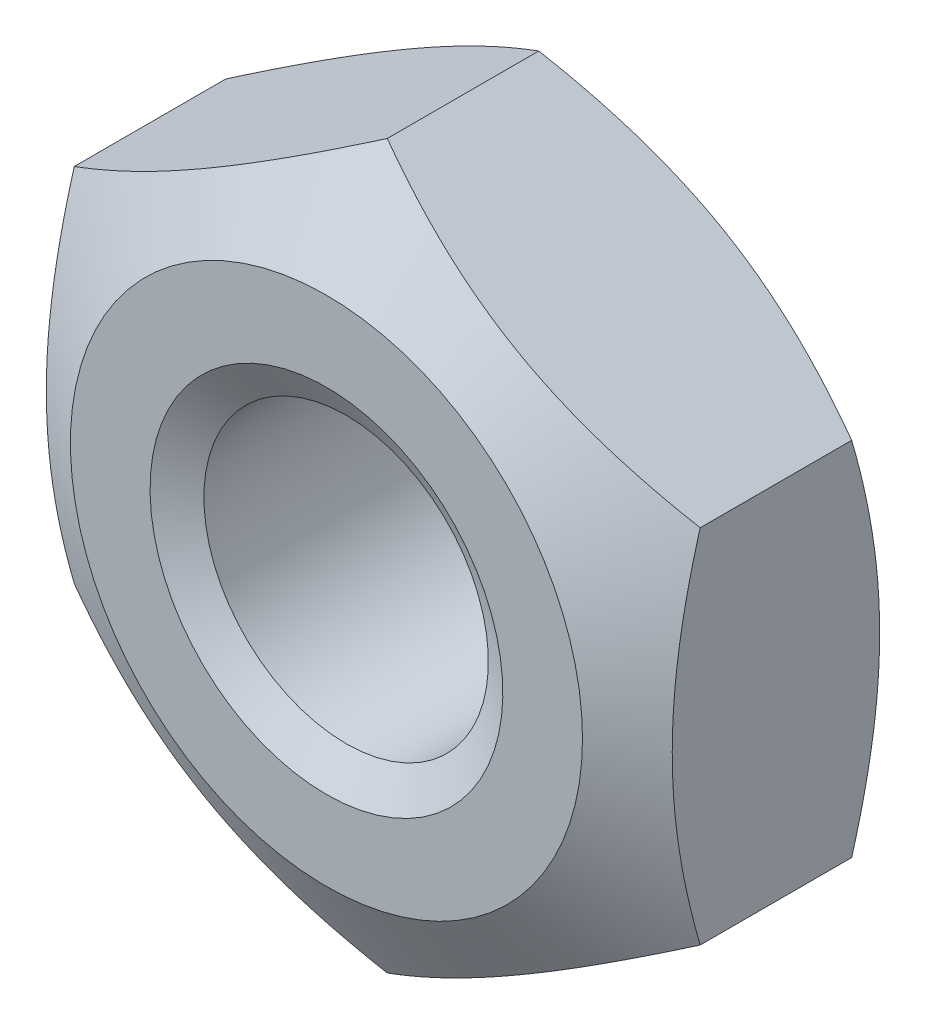
ISO-10303-21;
HEADER;
FILE_DESCRIPTION(('STEP AP214'),'2;1');
FILE_NAME('part.step','',(''),(''),'','','');
FILE_SCHEMA(('AUTOMOTIVE_DESIGN { 1 0 10303 214 1 1 1 1 }'));
ENDSEC;
DATA;
#1=APPLICATION_CONTEXT('core data for automotive mechanical design processes');
#2=APPLICATION_PROTOCOL_DEFINITION('international standard','automotive_design',2000,#1);
#3=PRODUCT_CONTEXT('',#1,'mechanical');
#4=PRODUCT('Part','Part','',(#3));
#5=PRODUCT_RELATED_PRODUCT_CATEGORY('part','',(#4));
#6=PRODUCT_DEFINITION_FORMATION('','',#4);
#7=PRODUCT_DEFINITION_CONTEXT('part definition',#1,'design');
#8=PRODUCT_DEFINITION('design','',#6,#7);
#9=PRODUCT_DEFINITION_SHAPE('','',#8);
#10=(LENGTH_UNIT() NAMED_UNIT(*) SI_UNIT(.MILLI.,.METRE.));
#11=(NAMED_UNIT(*) PLANE_ANGLE_UNIT() SI_UNIT($,.RADIAN.));
#12=(NAMED_UNIT(*) SI_UNIT($,.STERADIAN.) SOLID_ANGLE_UNIT());
#13=UNCERTAINTY_MEASURE_WITH_UNIT(LENGTH_MEASURE(1.E-05),#10,'distance_accuracy_value','');
#14=(GEOMETRIC_REPRESENTATION_CONTEXT(3) GLOBAL_UNCERTAINTY_ASSIGNED_CONTEXT((#13)) GLOBAL_UNIT_ASSIGNED_CONTEXT((#10,
#11,#12)) REPRESENTATION_CONTEXT('',''));
#15=CARTESIAN_POINT('',(0.,0.,0.));
#16=DIRECTION('',(0.,0.,1.));
#17=DIRECTION('',(1.,0.,0.));
#18=AXIS2_PLACEMENT_3D('',#15,#16,#17);
#19=CARTESIAN_POINT('',(0.,0.,0.));
#20=DIRECTION('',(0.,0.,1.));
#21=DIRECTION('',(1.,0.,0.));
#22=AXIS2_PLACEMENT_3D('',#19,#20,#21);
#23=PLANE('',#22);
#24=CARTESIAN_POINT('',(0.,0.,0.));
#25=DIRECTION('',(0.,0.,1.));
#26=DIRECTION('',(0.,-1.,0.));
#27=AXIS2_PLACEMENT_3D('',#24,#25,#26);
#28=CIRCLE('',#27,1.55);
#29=CARTESIAN_POINT('',(0.,-1.54999999999999,0.));
#30=VERTEX_POINT('',#29);
#31=EDGE_CURVE('E266',#30,#30,#28,.T.);
#32=ORIENTED_EDGE('',*,*,#31,.F.);
#33=EDGE_LOOP('',(#32));
#34=FACE_BOUND('',#33,.T.);
#35=CARTESIAN_POINT('',(0.,0.,0.));
#36=DIRECTION('',(0.,0.,1.));
#37=DIRECTION('',(1.,0.,0.));
#38=AXIS2_PLACEMENT_3D('',#35,#36,#37);
#39=CIRCLE('',#38,2.25);
#40=CARTESIAN_POINT('',(2.25,0.,0.));
#41=VERTEX_POINT('',#40);
#42=EDGE_CURVE('E225',#41,#41,#39,.T.);
#43=ORIENTED_EDGE('',*,*,#42,.T.);
#44=EDGE_LOOP('',(#43));
#45=FACE_BOUND('',#44,.T.);
#46=ADVANCED_FACE('F38',(#34,#45),#23,.T.);
#47=CARTESIAN_POINT('',(0.,0.,0.));
#48=DIRECTION('',(0.,0.,-1.));
#49=DIRECTION('',(-1.,0.,0.));
#50=AXIS2_PLACEMENT_3D('',#47,#48,#49);
#51=CONICAL_SURFACE('',#50,2.25,1.0471975511966);
#52=CARTESIAN_POINT('',(-2.75020000000001,1.58759777021761,-0.534361897959571));
#53=CARTESIAN_POINT('',(-2.6293507793401,1.65737010029696,-0.494062796844074));
#54=CARTESIAN_POINT('',(-2.50745839737738,1.72774469983531,-0.457412037192472));
#55=CARTESIAN_POINT('',(-2.26156287327212,1.86971254687,-0.39343731756461));
#56=CARTESIAN_POINT('',(-2.13755536142616,1.94130831721581,-0.366135990269306));
#57=CARTESIAN_POINT('',(-1.89107720202407,2.08361254889597,-0.323636879888924));
#58=CARTESIAN_POINT('',(-1.7686444814126,2.15429911309862,-0.308156253217264));
#59=CARTESIAN_POINT('',(-1.5232028576311,2.29600490065921,-0.289674531964746));
#60=CARTESIAN_POINT('',(-1.4001948467671,2.36702360884402,-0.286658134057405));
#61=CARTESIAN_POINT('',(-1.17034121338922,2.49972966594895,-0.292928280023351));
#62=CARTESIAN_POINT('',(-1.06346120874599,2.56143686540071,-0.300675288871507));
#63=CARTESIAN_POINT('',(-0.85039753266526,2.68444923614045,-0.325230315659159));
#64=CARTESIAN_POINT('',(-0.744214598351119,2.74575398185006,-0.342046724245375));
#65=CARTESIAN_POINT('',(-0.530711510606822,2.86902004703205,-0.384087056940762));
#66=CARTESIAN_POINT('',(-0.42341838385715,2.93096576264317,-0.409489215282037));
#67=CARTESIAN_POINT('',(-0.210432520715951,3.05393320806133,-0.467142360434789));
#68=CARTESIAN_POINT('',(-0.104737054973348,3.11495651365994,-0.49937979789379));
#69=CARTESIAN_POINT('',(0.000199999999999974,3.17554195059677,-0.534361897959569));
#70=B_SPLINE_CURVE_WITH_KNOTS('',3,(#52,#53,#54,#55,#56,#57,#58,#59,#60,#61,#62,#63,#64,#65,#66,
#67,#68,#69),.UNSPECIFIED.,.F.,.F.,(4,2,2,2,2,2,2,2,4),(0.,0.435912828725888,0.872873557116332,
1.29901931904671,1.72464171213573,2.09526089052938,2.46622354066375,2.84541551798559,
3.22386274754526),.UNSPECIFIED.);
#71=CARTESIAN_POINT('',(-2.75,1.58771324027145,-0.534295227656671));
#72=VERTEX_POINT('',#71);
#73=CARTESIAN_POINT('',(0.,3.17542648054293,-0.534295227656671));
#74=VERTEX_POINT('',#73);
#75=EDGE_CURVE('E220',#72,#74,#70,.T.);
#76=ORIENTED_EDGE('',*,*,#75,.F.);
#77=CARTESIAN_POINT('',(-2.74999999999998,-4.17094191172018,-1.58535995000983));
#78=CARTESIAN_POINT('',(-2.74999999999998,-4.05157417919455,-1.52783985485414));
#79=CARTESIAN_POINT('',(-2.74999999999999,-3.93192208680263,-1.47089921340537));
#80=CARTESIAN_POINT('',(-2.74999999999999,-3.69189754974667,-1.35850483223983));
#81=CARTESIAN_POINT('',(-2.74999999999999,-3.57152498585856,-1.30305134743429));
#82=CARTESIAN_POINT('',(-2.74999999999999,-3.3292414178549,-1.19365987345141));
#83=CARTESIAN_POINT('',(-2.74999999999999,-3.20732553286572,-1.1397326551652));
#84=CARTESIAN_POINT('',(-2.74999999999999,-2.96249043886675,-1.03421478265883));
#85=CARTESIAN_POINT('',(-2.74999999999999,-2.83957128062765,-0.982624011057358));
#86=CARTESIAN_POINT('',(-2.74999999999999,-2.58897064424779,-0.880953460848801));
#87=CARTESIAN_POINT('',(-2.74999999999999,-2.46125395597333,-0.830959972131938));
#88=CARTESIAN_POINT('',(-2.74999999999999,-2.20429217508488,-0.734989140643749));
#89=CARTESIAN_POINT('',(-2.74999999999999,-2.0750469081031,-0.689012261170476));
#90=CARTESIAN_POINT('',(-2.74999999999999,-1.81509622614656,-0.602350799198662));
#91=CARTESIAN_POINT('',(-2.75,-1.68439471248182,-0.561654637381358));
#92=CARTESIAN_POINT('',(-2.75,-1.42112044045795,-0.486921696520409));
#93=CARTESIAN_POINT('',(-2.75,-1.28854831568341,-0.452882718076814));
#94=CARTESIAN_POINT('',(-2.75,-1.02216222796121,-0.393330190707876));
#95=CARTESIAN_POINT('',(-2.75,-0.888357777462689,-0.367774900827353));
#96=CARTESIAN_POINT('',(-2.75,-0.619188443271271,-0.326700866431593));
#97=CARTESIAN_POINT('',(-2.75,-0.483823678897038,-0.311181359585503));
#98=CARTESIAN_POINT('',(-2.75,-0.213936143558709,-0.291620721702803));
#99=CARTESIAN_POINT('',(-2.75,-0.0794237789789004,-0.287439497799149));
#100=CARTESIAN_POINT('',(-2.75,0.189476875095198,-0.290546406339069));
#101=CARTESIAN_POINT('',(-2.75,0.323865159350496,-0.297835002730547));
#102=CARTESIAN_POINT('',(-2.75,0.554893379449256,-0.319724470777096));
#103=CARTESIAN_POINT('',(-2.75000000000001,0.651787779258228,-0.331774817011496));
#104=CARTESIAN_POINT('',(-2.75000000000001,0.844801886898879,-0.361034396057224));
#105=CARTESIAN_POINT('',(-2.75000000000001,0.940921474752412,-0.37824441265319));
#106=CARTESIAN_POINT('',(-2.75000000000001,1.22801374432727,-0.436704923279867));
#107=CARTESIAN_POINT('',(-2.75000000000001,1.41759987178668,-0.484773071382858));
#108=CARTESIAN_POINT('',(-2.75000000000001,1.79688918277039,-0.595144853922151));
#109=CARTESIAN_POINT('',(-2.75000000000001,1.98650596068932,-0.65773427101591));
#110=CARTESIAN_POINT('',(-2.75000000000001,2.26832259438815,-0.758664209554614));
#111=CARTESIAN_POINT('',(-2.75000000000001,2.36181446832384,-0.793476731430835));
#112=CARTESIAN_POINT('',(-2.75000000000001,2.54803932294426,-0.865075780032284));
#113=CARTESIAN_POINT('',(-2.75000000000001,2.6407723109558,-0.901862287673288));
#114=CARTESIAN_POINT('',(-2.75000000000002,2.85279068758439,-0.988151634401225));
#115=CARTESIAN_POINT('',(-2.75000000000002,2.97185009604171,-1.03820800297955));
#116=CARTESIAN_POINT('',(-2.75000000000002,3.20902736987715,-1.14050851197707));
#117=CARTESIAN_POINT('',(-2.75000000000002,3.32714519214704,-1.19275275188562));
#118=CARTESIAN_POINT('',(-2.75000000000002,3.68035595861855,-1.35211254525139));
#119=CARTESIAN_POINT('',(-2.75000000000002,3.9142692376034,-1.46183979317702));
#120=CARTESIAN_POINT('',(-2.75000000000002,4.38006837711245,-1.68598214563198));
#121=CARTESIAN_POINT('',(-2.75000000000002,4.61195228635671,-1.80040126470261));
#122=CARTESIAN_POINT('',(-2.75000000000002,5.07411991279684,-2.03243730193511));
#123=CARTESIAN_POINT('',(-2.75000000000003,5.30440357913535,-2.15005432115122));
#124=CARTESIAN_POINT('',(-2.75000000000003,5.74575965877126,-2.37825325657572));
#125=CARTESIAN_POINT('',(-2.75000000000003,5.9569214419775,-2.48866288043221));
#126=CARTESIAN_POINT('',(-2.75000000000003,6.37847605090656,-2.71095354359167));
#127=CARTESIAN_POINT('',(-2.75000000000003,6.5888688543058,-2.82283462518444));
#128=CARTESIAN_POINT('',(-2.75000000000003,7.00860016719332,-3.04748460058433));
#129=CARTESIAN_POINT('',(-2.75000000000003,7.21793996928446,-3.16025108273532));
#130=CARTESIAN_POINT('',(-2.75000000000004,7.63612432069422,-3.38667545638205));
#131=CARTESIAN_POINT('',(-2.75000000000004,7.84496889300508,-3.50033330539519));
#132=CARTESIAN_POINT('',(-2.75000000000004,8.05362923922143,-3.61432611594186));
#133=B_SPLINE_CURVE_WITH_KNOTS('',3,(#77,#78,#79,#80,#81,#82,#83,#84,#85,#86,#87,#88,#89,#90,
#91,#92,#93,#94,#95,#96,#97,#98,#99,#100,#101,#102,#103,#104,#105,#106,#107,#108,#109,#110,#111,
#112,#113,#114,#115,#116,#117,#118,#119,#120,#121,#122,#123,#124,#125,#126,#127,#128,#129,#130,
#131,#132),.UNSPECIFIED.,.F.,.F.,(4,2,2,2,2,2,2,2,2,2,2,2,2,2,2,2,2,2,2,2,2,2,2,2,2,2,2,4),(0.,
0.397516289629709,0.795100286958886,1.19501152551803,1.59490265050159,2.00630901998287,
2.41776278088078,2.8282985036957,3.23869836376216,3.64704799033318,4.05536659450197,
4.45861662670271,4.86188297056404,5.15466277742565,5.44748708183662,6.03349625442335,
6.63219807054858,6.93146946485046,7.23073796635865,7.61817202589461,8.00562372244204,
8.78064716960591,9.55634818940369,10.3320737500517,11.0469209777075,11.7617887952143,
12.4751271265047,13.1884316641826),.UNSPECIFIED.);
#134=CARTESIAN_POINT('',(-2.75,-1.58771324027146,-0.534295227656671));
#135=VERTEX_POINT('',#134);
#136=EDGE_CURVE('E188',#135,#72,#133,.T.);
#137=ORIENTED_EDGE('',*,*,#136,.F.);
#138=CARTESIAN_POINT('',(0.000200000000020716,-3.17554195059679,-0.534361897959577));
#139=CARTESIAN_POINT('',(-0.120649220659886,-3.10576962051743,-0.49406279684408));
#140=CARTESIAN_POINT('',(-0.242541602622614,-3.03539502097909,-0.457412037192478));
#141=CARTESIAN_POINT('',(-0.488437126727875,-2.89342717394439,-0.393437317564616));
#142=CARTESIAN_POINT('',(-0.612444638573838,-2.82183140359859,-0.366135990269313));
#143=CARTESIAN_POINT('',(-0.858922797975928,-2.67952717191843,-0.323636879888932));
#144=CARTESIAN_POINT('',(-0.981355518587402,-2.60884060771578,-0.308156253217272));
#145=CARTESIAN_POINT('',(-1.2267971423689,-2.4671348201552,-0.289674531964755));
#146=CARTESIAN_POINT('',(-1.3498051532329,-2.39611611197039,-0.286658134057414));
#147=CARTESIAN_POINT('',(-1.57965878661078,-2.26341005486546,-0.292928280023361));
#148=CARTESIAN_POINT('',(-1.68653879125401,-2.2017028554137,-0.300675288871517));
#149=CARTESIAN_POINT('',(-1.89960246733474,-2.07869048467396,-0.325230315659169));
#150=CARTESIAN_POINT('',(-2.00578540164888,-2.01738573896435,-0.342046724245385));
#151=CARTESIAN_POINT('',(-2.21928848939318,-1.89411967378236,-0.384087056940771));
#152=CARTESIAN_POINT('',(-2.32658161614285,-1.83217395817124,-0.409489215282046));
#153=CARTESIAN_POINT('',(-2.53956747928405,-1.70920651275309,-0.467142360434797));
#154=CARTESIAN_POINT('',(-2.64526294502665,-1.64818320715448,-0.499379797893798));
#155=CARTESIAN_POINT('',(-2.7502,-1.58759777021765,-0.534361897959576));
#156=B_SPLINE_CURVE_WITH_KNOTS('',3,(#138,#139,#140,#141,#142,#143,#144,#145,#146,#147,#148,
#149,#150,#151,#152,#153,#154,#155),.UNSPECIFIED.,.F.,.F.,(4,2,2,2,2,2,2,2,4),(0.,
0.43591282872589,0.872873557116335,1.29901931904672,1.72464171213574,2.09526089052938,
2.46622354066375,2.84541551798558,3.22386274754525),.UNSPECIFIED.);
#157=CARTESIAN_POINT('',(0.,-3.17542648054293,-0.534295227656671));
#158=VERTEX_POINT('',#157);
#159=EDGE_CURVE('E180',#158,#135,#156,.T.);
#160=ORIENTED_EDGE('',*,*,#159,.F.);
#161=CARTESIAN_POINT('',(2.7502,-1.58759777021763,-0.53436189795957));
#162=CARTESIAN_POINT('',(2.62935077934009,-1.65737010029698,-0.494062796844073));
#163=CARTESIAN_POINT('',(2.50745839737736,-1.72774469983533,-0.457412037192472));
#164=CARTESIAN_POINT('',(2.2615628732721,-1.86971254687003,-0.393437317564612));
#165=CARTESIAN_POINT('',(2.13755536142614,-1.94130831721583,-0.366135990269309));
#166=CARTESIAN_POINT('',(1.89107720202405,-2.08361254889599,-0.323636879888929));
#167=CARTESIAN_POINT('',(1.76864448141258,-2.15429911309864,-0.308156253217271));
#168=CARTESIAN_POINT('',(1.52320285763108,-2.29600490065923,-0.289674531964754));
#169=CARTESIAN_POINT('',(1.40019484676709,-2.36702360884404,-0.286658134057414));
#170=CARTESIAN_POINT('',(1.17034121338921,-2.49972966594898,-0.292928280023363));
#171=CARTESIAN_POINT('',(1.06346120874598,-2.56143686540073,-0.300675288871519));
#172=CARTESIAN_POINT('',(0.850397532665258,-2.68444923614047,-0.325230315659172));
#173=CARTESIAN_POINT('',(0.74421459835112,-2.74575398185008,-0.342046724245387));
#174=CARTESIAN_POINT('',(0.530711510606829,-2.86902004703207,-0.384087056940773));
#175=CARTESIAN_POINT('',(0.423418383857159,-2.93096576264319,-0.409489215282048));
#176=CARTESIAN_POINT('',(0.210432520715966,-3.05393320806134,-0.467142360434799));
#177=CARTESIAN_POINT('',(0.104737054973367,-3.11495651365996,-0.499379797893799));
#178=CARTESIAN_POINT('',(-0.000199999999979356,-3.17554195059679,-0.534361897959577));
#179=B_SPLINE_CURVE_WITH_KNOTS('',3,(#161,#162,#163,#164,#165,#166,#167,#168,#169,#170,#171,
#172,#173,#174,#175,#176,#177,#178),.UNSPECIFIED.,.F.,.F.,(4,2,2,2,2,2,2,2,4),(0.,
0.435912828725888,0.872873557116332,1.29901931904672,1.72464171213574,2.09526089052937,
2.46622354066373,2.84541551798556,3.22386274754523),.UNSPECIFIED.);
#180=CARTESIAN_POINT('',(2.74999999999999,-1.58771324027147,-0.534295227656671));
#181=VERTEX_POINT('',#180);
#182=EDGE_CURVE('E96',#181,#158,#179,.T.);
#183=ORIENTED_EDGE('',*,*,#182,.F.);
#184=CARTESIAN_POINT('',(2.75,-4.17094191172015,-1.58535995000982));
#185=CARTESIAN_POINT('',(2.75,-4.05157417919452,-1.52783985485413));
#186=CARTESIAN_POINT('',(2.75,-3.9319220868026,-1.47089921340535));
#187=CARTESIAN_POINT('',(2.75,-3.69189754974664,-1.35850483223982));
#188=CARTESIAN_POINT('',(2.75,-3.57152498585853,-1.30305134743428));
#189=CARTESIAN_POINT('',(2.75,-3.32924141785487,-1.1936598734514));
#190=CARTESIAN_POINT('',(2.75,-3.20732553286569,-1.13973265516519));
#191=CARTESIAN_POINT('',(2.75,-2.96249043886672,-1.03421478265882));
#192=CARTESIAN_POINT('',(2.75,-2.83957128062762,-0.982624011057348));
#193=CARTESIAN_POINT('',(2.75,-2.58897064424776,-0.880953460848792));
#194=CARTESIAN_POINT('',(2.75,-2.4612539559733,-0.830959972131929));
#195=CARTESIAN_POINT('',(2.75,-2.20429217508485,-0.734989140643741));
#196=CARTESIAN_POINT('',(2.75,-2.07504690810308,-0.689012261170468));
#197=CARTESIAN_POINT('',(2.75,-1.81509622614653,-0.602350799198655));
#198=CARTESIAN_POINT('',(2.75,-1.6843947124818,-0.56165463738135));
#199=CARTESIAN_POINT('',(2.75,-1.42112044045793,-0.486921696520402));
#200=CARTESIAN_POINT('',(2.75,-1.28854831568339,-0.452882718076808));
#201=CARTESIAN_POINT('',(2.75,-1.02216222796119,-0.393330190707871));
#202=CARTESIAN_POINT('',(2.75,-0.888357777462668,-0.367774900827347));
#203=CARTESIAN_POINT('',(2.75,-0.619188443271251,-0.326700866431588));
#204=CARTESIAN_POINT('',(2.75,-0.483823678897018,-0.311181359585498));
#205=CARTESIAN_POINT('',(2.75,-0.213936143558689,-0.291620721702799));
#206=CARTESIAN_POINT('',(2.75,-0.0794237789788813,-0.287439497799145));
#207=CARTESIAN_POINT('',(2.75,0.189476875095217,-0.290546406339066));
#208=CARTESIAN_POINT('',(2.75,0.323865159350514,-0.297835002730543));
#209=CARTESIAN_POINT('',(2.75,0.554893379449273,-0.319724470777093));
#210=CARTESIAN_POINT('',(2.75,0.651787779258245,-0.331774817011493));
#211=CARTESIAN_POINT('',(2.75,0.844801886898896,-0.361034396057221));
#212=CARTESIAN_POINT('',(2.75,0.940921474752429,-0.378244412653187));
#213=CARTESIAN_POINT('',(2.75,1.22801374432728,-0.436704923279864));
#214=CARTESIAN_POINT('',(2.75,1.4175998717867,-0.484773071382855));
#215=CARTESIAN_POINT('',(2.75,1.79688918277041,-0.595144853922149));
#216=CARTESIAN_POINT('',(2.75,1.98650596068934,-0.657734271015908));
#217=CARTESIAN_POINT('',(2.75,2.26832259438817,-0.758664209554612));
#218=CARTESIAN_POINT('',(2.75,2.36181446832386,-0.793476731430834));
#219=CARTESIAN_POINT('',(2.75,2.54803932294428,-0.865075780032283));
#220=CARTESIAN_POINT('',(2.75,2.64077231095581,-0.901862287673287));
#221=CARTESIAN_POINT('',(2.75,2.85279068758441,-0.988151634401225));
#222=CARTESIAN_POINT('',(2.75,2.97185009604173,-1.03820800297955));
#223=CARTESIAN_POINT('',(2.75,3.20902736987717,-1.14050851197707));
#224=CARTESIAN_POINT('',(2.75,3.32714519214706,-1.19275275188562));
#225=CARTESIAN_POINT('',(2.75,3.68035595861857,-1.35211254525139));
#226=CARTESIAN_POINT('',(2.75,3.91426923760343,-1.46183979317702));
#227=CARTESIAN_POINT('',(2.75,4.38006837711248,-1.68598214563198));
#228=CARTESIAN_POINT('',(2.75,4.61195228635674,-1.80040126470262));
#229=CARTESIAN_POINT('',(2.75,5.07411991279688,-2.03243730193512));
#230=CARTESIAN_POINT('',(2.75,5.30440357913539,-2.15005432115123));
#231=CARTESIAN_POINT('',(2.75,5.7457596587713,-2.37825325657574));
#232=CARTESIAN_POINT('',(2.75,5.95692144197755,-2.48866288043222));
#233=CARTESIAN_POINT('',(2.75,6.37847605090661,-2.71095354359168));
#234=CARTESIAN_POINT('',(2.75,6.58886885430584,-2.82283462518446));
#235=CARTESIAN_POINT('',(2.75,7.00860016719337,-3.04748460058435));
#236=CARTESIAN_POINT('',(2.75,7.21793996928451,-3.16025108273533));
#237=CARTESIAN_POINT('',(2.75,7.63612432069427,-3.38667545638207));
#238=CARTESIAN_POINT('',(2.75,7.84496889300514,-3.50033330539521));
#239=CARTESIAN_POINT('',(2.75,8.05362923922149,-3.61432611594188));
#240=B_SPLINE_CURVE_WITH_KNOTS('',3,(#184,#185,#186,#187,#188,#189,#190,#191,#192,#193,#194,
#195,#196,#197,#198,#199,#200,#201,#202,#203,#204,#205,#206,#207,#208,#209,#210,#211,#212,#213,
#214,#215,#216,#217,#218,#219,#220,#221,#222,#223,#224,#225,#226,#227,#228,#229,#230,#231,#232,
#233,#234,#235,#236,#237,#238,#239),.UNSPECIFIED.,.F.,.F.,(4,2,2,2,2,2,2,2,2,2,2,2,2,2,2,2,2,2,
2,2,2,2,2,2,2,2,2,4),(0.,0.397516289629708,0.795100286958884,1.19501152551802,1.59490265050159,
2.00630901998287,2.41776278088077,2.82829850369569,3.23869836376215,3.64704799033317,
4.05536659450196,4.4586166267027,4.86188297056402,5.15466277742563,5.4474870818366,
6.03349625442333,6.63219807054856,6.93146946485044,7.23073796635863,7.6181720258946,
8.00562372244203,8.78064716960591,9.55634818940369,10.3320737500517,11.0469209777075,
11.7617887952143,12.4751271265048,13.1884316641826),.UNSPECIFIED.);
#241=CARTESIAN_POINT('',(2.75,1.58771324027146,-0.534295227656671));
#242=VERTEX_POINT('',#241);
#243=EDGE_CURVE('E92',#242,#181,#240,.F.);
#244=ORIENTED_EDGE('',*,*,#243,.F.);
#245=CARTESIAN_POINT('',(-0.0002,3.17554195059677,-0.534361897959569));
#246=CARTESIAN_POINT('',(0.120649220659906,3.10576962051742,-0.494062796844072));
#247=CARTESIAN_POINT('',(0.242541602622634,3.03539502097908,-0.457412037192472));
#248=CARTESIAN_POINT('',(0.488437126727894,2.89342717394438,-0.393437317564611));
#249=CARTESIAN_POINT('',(0.612444638573858,2.82183140359858,-0.366135990269308));
#250=CARTESIAN_POINT('',(0.858922797975947,2.67952717191842,-0.323636879888929));
#251=CARTESIAN_POINT('',(0.981355518587421,2.60884060771577,-0.308156253217271));
#252=CARTESIAN_POINT('',(1.22679714236892,2.46713482015519,-0.289674531964755));
#253=CARTESIAN_POINT('',(1.34980515323292,2.39611611197038,-0.286658134057415));
#254=CARTESIAN_POINT('',(1.5796587866108,2.26341005486545,-0.292928280023363));
#255=CARTESIAN_POINT('',(1.68653879125403,2.20170285541369,-0.300675288871519));
#256=CARTESIAN_POINT('',(1.89960246733475,2.07869048467396,-0.325230315659172));
#257=CARTESIAN_POINT('',(2.00578540164889,2.01738573896435,-0.342046724245388));
#258=CARTESIAN_POINT('',(2.21928848939318,1.89411967378237,-0.384087056940775));
#259=CARTESIAN_POINT('',(2.32658161614285,1.83217395817125,-0.409489215282049));
#260=CARTESIAN_POINT('',(2.53956747928405,1.7092065127531,-0.4671423604348));
#261=CARTESIAN_POINT('',(2.64526294502665,1.64818320715448,-0.4993797978938));
#262=CARTESIAN_POINT('',(2.7502,1.58759777021766,-0.534361897959578));
#263=B_SPLINE_CURVE_WITH_KNOTS('',3,(#245,#246,#247,#248,#249,#250,#251,#252,#253,#254,#255,
#256,#257,#258,#259,#260,#261,#262),.UNSPECIFIED.,.F.,.F.,(4,2,2,2,2,2,2,2,4),(0.,
0.435912828725888,0.872873557116331,1.29901931904671,1.72464171213573,2.09526089052937,
2.46622354066373,2.84541551798556,3.22386274754522),.UNSPECIFIED.);
#264=EDGE_CURVE('E64',#74,#242,#263,.T.);
#265=ORIENTED_EDGE('',*,*,#264,.F.);
#266=EDGE_LOOP('',(#76,#137,#160,#183,#244,#265));
#267=FACE_BOUND('',#266,.T.);
#268=ORIENTED_EDGE('',*,*,#42,.F.);
#269=EDGE_LOOP('',(#268));
#270=FACE_BOUND('',#269,.T.);
#271=ADVANCED_FACE('F93',(#267,#270),#51,.T.);
#272=CARTESIAN_POINT('',(2.75,1.58771324027149,-2.4));
#273=DIRECTION('',(0.499999999999993,0.866025403784443,0.));
#274=DIRECTION('',(-0.866025403784443,0.499999999999993,0.));
#275=AXIS2_PLACEMENT_3D('',#272,#273,#274);
#276=PLANE('',#275);
#277=DIRECTION('',(0.,0.,1.));
#278=VECTOR('',#277,1.);
#279=CARTESIAN_POINT('',(2.75,1.58771324027149,-2.4));
#280=LINE('',#279,#278);
#281=CARTESIAN_POINT('',(2.75,1.58771324027146,-1.86570477234333));
#282=VERTEX_POINT('',#281);
#283=EDGE_CURVE('E11',#282,#242,#280,.T.);
#284=ORIENTED_EDGE('',*,*,#283,.F.);
#285=CARTESIAN_POINT('',(2.7502,1.58759777021766,-1.86563810204042));
#286=CARTESIAN_POINT('',(2.62935077934009,1.65737010029701,-1.90593720315592));
#287=CARTESIAN_POINT('',(2.50745839737736,1.72774469983535,-1.94258796280752));
#288=CARTESIAN_POINT('',(2.2615628732721,1.86971254687005,-2.00656268243538));
#289=CARTESIAN_POINT('',(2.13755536142614,1.94130831721585,-2.03386400973069));
#290=CARTESIAN_POINT('',(1.89107720202405,2.08361254889601,-2.07636312011107));
#291=CARTESIAN_POINT('',(1.76864448141257,2.15429911309866,-2.09184374678273));
#292=CARTESIAN_POINT('',(1.52320285763107,2.29600490065924,-2.11032546803524));
#293=CARTESIAN_POINT('',(1.40019484676707,2.36702360884405,-2.11334186594259));
#294=CARTESIAN_POINT('',(1.17034121338919,2.49972966594898,-2.10707171997664));
#295=CARTESIAN_POINT('',(1.06346120874597,2.56143686540074,-2.09932471112848));
#296=CARTESIAN_POINT('',(0.85039753266524,2.68444923614047,-2.07476968434083));
#297=CARTESIAN_POINT('',(0.744214598351102,2.74575398185008,-2.05795327575462));
#298=CARTESIAN_POINT('',(0.53071151060681,2.86902004703206,-2.01591294305923));
#299=CARTESIAN_POINT('',(0.42341838385714,2.93096576264318,-1.99051078471796));
#300=CARTESIAN_POINT('',(0.210432520715947,3.05393320806133,-1.93285763956521));
#301=CARTESIAN_POINT('',(0.104737054973347,3.11495651365995,-1.90062020210621));
#302=CARTESIAN_POINT('',(-0.000199999999999647,3.17554195059677,-1.86563810204043));
#303=B_SPLINE_CURVE_WITH_KNOTS('',3,(#285,#286,#287,#288,#289,#290,#291,#292,#293,#294,#295,
#296,#297,#298,#299,#300,#301,#302),.UNSPECIFIED.,.F.,.F.,(4,2,2,2,2,2,2,2,4),(0.,
0.435912828725889,0.872873557116334,1.29901931904672,1.72464171213574,2.09526089052937,
2.46622354066374,2.84541551798556,3.22386274754522),.UNSPECIFIED.);
#304=CARTESIAN_POINT('',(0.,3.17542648054293,-1.86570477234333));
#305=VERTEX_POINT('',#304);
#306=EDGE_CURVE('E112',#282,#305,#303,.T.);
#307=ORIENTED_EDGE('',*,*,#306,.T.);
#308=DIRECTION('',(0.,0.,1.));
#309=VECTOR('',#308,1.);
#310=CARTESIAN_POINT('',(0.,3.17542648054293,-2.4));
#311=LINE('',#310,#309);
#312=EDGE_CURVE('E43',#305,#74,#311,.T.);
#313=ORIENTED_EDGE('',*,*,#312,.T.);
#314=ORIENTED_EDGE('',*,*,#264,.T.);
#315=EDGE_LOOP('',(#284,#307,#313,#314));
#316=FACE_BOUND('',#315,.T.);
#317=ADVANCED_FACE('F40',(#316),#276,.T.);
#318=CARTESIAN_POINT('',(2.75,-1.58771324027147,-2.4));
#319=DIRECTION('',(1.,0.,0.));
#320=DIRECTION('',(0.,0.,-1.));
#321=AXIS2_PLACEMENT_3D('',#318,#319,#320);
#322=PLANE('',#321);
#323=DIRECTION('',(0.,0.,1.));
#324=VECTOR('',#323,1.);
#325=CARTESIAN_POINT('',(2.75,-1.58771324027147,-2.4));
#326=LINE('',#325,#324);
#327=CARTESIAN_POINT('',(2.74999999999999,-1.58771324027147,-1.86570477234333));
#328=VERTEX_POINT('',#327);
#329=EDGE_CURVE('E48',#328,#181,#326,.T.);
#330=ORIENTED_EDGE('',*,*,#329,.F.);
#331=CARTESIAN_POINT('',(2.75,-4.17094191172015,-0.814640049990189));
#332=CARTESIAN_POINT('',(2.75,-4.05157417919452,-0.872160145145874));
#333=CARTESIAN_POINT('',(2.75,-3.9319220868026,-0.929100786594652));
#334=CARTESIAN_POINT('',(2.75,-3.69189754974664,-1.04149516776018));
#335=CARTESIAN_POINT('',(2.75,-3.57152498585853,-1.09694865256572));
#336=CARTESIAN_POINT('',(2.75,-3.32924141785487,-1.2063401265486));
#337=CARTESIAN_POINT('',(2.75,-3.20732553286569,-1.26026734483481));
#338=CARTESIAN_POINT('',(2.75,-2.96249043886672,-1.36578521734119));
#339=CARTESIAN_POINT('',(2.75,-2.83957128062762,-1.41737598894266));
#340=CARTESIAN_POINT('',(2.75,-2.58897064424776,-1.51904653915121));
#341=CARTESIAN_POINT('',(2.75,-2.4612539559733,-1.56904002786807));
#342=CARTESIAN_POINT('',(2.75,-2.20429217508485,-1.66501085935626));
#343=CARTESIAN_POINT('',(2.75,-2.07504690810308,-1.71098773882953));
#344=CARTESIAN_POINT('',(2.75,-1.81509622614653,-1.79764920080135));
#345=CARTESIAN_POINT('',(2.75,-1.6843947124818,-1.83834536261865));
#346=CARTESIAN_POINT('',(2.75,-1.42112044045793,-1.9130783034796));
#347=CARTESIAN_POINT('',(2.75,-1.28854831568339,-1.94711728192319));
#348=CARTESIAN_POINT('',(2.75,-1.02216222796118,-2.00666980929213));
#349=CARTESIAN_POINT('',(2.75,-0.888357777462668,-2.03222509917265));
#350=CARTESIAN_POINT('',(2.75,-0.619188443271251,-2.07329913356841));
#351=CARTESIAN_POINT('',(2.75,-0.483823678897018,-2.0888186404145));
#352=CARTESIAN_POINT('',(2.75,-0.21393614355869,-2.1083792782972));
#353=CARTESIAN_POINT('',(2.75,-0.0794237789788815,-2.11256050220086));
#354=CARTESIAN_POINT('',(2.75,0.189476875095216,-2.10945359366093));
#355=CARTESIAN_POINT('',(2.75,0.323865159350513,-2.10216499726946));
#356=CARTESIAN_POINT('',(2.75,0.554893379449272,-2.08027552922291));
#357=CARTESIAN_POINT('',(2.75,0.651787779258244,-2.06822518298851));
#358=CARTESIAN_POINT('',(2.75,0.844801886898897,-2.03896560394278));
#359=CARTESIAN_POINT('',(2.75,0.94092147475243,-2.02175558734681));
#360=CARTESIAN_POINT('',(2.75,1.22801374432729,-1.96329507672014));
#361=CARTESIAN_POINT('',(2.75,1.41759987178671,-1.91522692861715));
#362=CARTESIAN_POINT('',(2.75,1.79688918277042,-1.80485514607785));
#363=CARTESIAN_POINT('',(2.75,1.98650596068935,-1.74226572898409));
#364=CARTESIAN_POINT('',(2.75,2.26832259438818,-1.64133579044539));
#365=CARTESIAN_POINT('',(2.75,2.36181446832387,-1.60652326856917));
#366=CARTESIAN_POINT('',(2.75,2.54803932294429,-1.53492421996772));
#367=CARTESIAN_POINT('',(2.75,2.64077231095583,-1.49813771232671));
#368=CARTESIAN_POINT('',(2.75,2.85279068758442,-1.41184836559877));
#369=CARTESIAN_POINT('',(2.75,2.97185009604174,-1.36179199702045));
#370=CARTESIAN_POINT('',(2.75,3.20902736987719,-1.25949148802293));
#371=CARTESIAN_POINT('',(2.75,3.32714519214708,-1.20724724811438));
#372=CARTESIAN_POINT('',(2.75,3.68035595861859,-1.04788745474861));
#373=CARTESIAN_POINT('',(2.75,3.91426923760344,-0.938160206822976));
#374=CARTESIAN_POINT('',(2.75,4.38006837711249,-0.714017854368019));
#375=CARTESIAN_POINT('',(2.75,4.61195228635675,-0.599598735297385));
#376=CARTESIAN_POINT('',(2.75,5.07411991279689,-0.36756269806488));
#377=CARTESIAN_POINT('',(2.75,5.3044035791354,-0.249945678848773));
#378=CARTESIAN_POINT('',(2.75,5.74575965877131,-0.0217467434242689));
#379=CARTESIAN_POINT('',(2.75,5.95692144197756,0.0886628804322174));
#380=CARTESIAN_POINT('',(2.75,6.37847605090662,0.310953543591677));
#381=CARTESIAN_POINT('',(2.75,6.58886885430586,0.42283462518445));
#382=CARTESIAN_POINT('',(2.75,7.00860016719338,0.647484600584343));
#383=CARTESIAN_POINT('',(2.75,7.21793996928452,0.760251082735328));
#384=CARTESIAN_POINT('',(2.75,7.63612432069429,0.986675456382062));
#385=CARTESIAN_POINT('',(2.75,7.84496889300515,1.1003333053952));
#386=CARTESIAN_POINT('',(2.75,8.0536292392215,1.21432611594187));
#387=B_SPLINE_CURVE_WITH_KNOTS('',3,(#331,#332,#333,#334,#335,#336,#337,#338,#339,#340,#341,
#342,#343,#344,#345,#346,#347,#348,#349,#350,#351,#352,#353,#354,#355,#356,#357,#358,#359,#360,
#361,#362,#363,#364,#365,#366,#367,#368,#369,#370,#371,#372,#373,#374,#375,#376,#377,#378,#379,
#380,#381,#382,#383,#384,#385,#386),.UNSPECIFIED.,.F.,.F.,(4,2,2,2,2,2,2,2,2,2,2,2,2,2,2,2,2,2,
2,2,2,2,2,2,2,2,2,4),(0.,0.397516289629709,0.795100286958884,1.19501152551802,1.59490265050159,
2.00630901998287,2.41776278088077,2.82829850369569,3.23869836376215,3.64704799033317,
4.05536659450196,4.4586166267027,4.86188297056402,5.15466277742563,5.44748708183661,
6.03349625442334,6.63219807054857,6.93146946485045,7.23073796635864,7.61817202589461,
8.00562372244204,8.78064716960592,9.5563481894037,10.3320737500517,11.0469209777075,
11.7617887952144,12.4751271265048,13.1884316641826),.UNSPECIFIED.);
#388=EDGE_CURVE('E110',#328,#282,#387,.T.);
#389=ORIENTED_EDGE('',*,*,#388,.T.);
#390=ORIENTED_EDGE('',*,*,#283,.T.);
#391=ORIENTED_EDGE('',*,*,#243,.T.);
#392=EDGE_LOOP('',(#330,#389,#390,#391));
#393=FACE_BOUND('',#392,.T.);
#394=ADVANCED_FACE('F109',(#393),#322,.T.);
#395=CARTESIAN_POINT('',(0.,-3.17542648054295,-2.4));
#396=DIRECTION('',(0.500000000000006,-0.866025403784435,0.));
#397=DIRECTION('',(0.866025403784435,0.500000000000006,0.));
#398=AXIS2_PLACEMENT_3D('',#395,#396,#397);
#399=PLANE('',#398);
#400=DIRECTION('',(0.,0.,1.));
#401=VECTOR('',#400,1.);
#402=CARTESIAN_POINT('',(0.,-3.17542648054295,-2.4));
#403=LINE('',#402,#401);
#404=CARTESIAN_POINT('',(0.,-3.17542648054293,-1.86570477234333));
#405=VERTEX_POINT('',#404);
#406=EDGE_CURVE('E209',#405,#158,#403,.T.);
#407=ORIENTED_EDGE('',*,*,#406,.F.);
#408=CARTESIAN_POINT('',(-0.000199999999979462,-3.17554195059679,-1.86563810204042));
#409=CARTESIAN_POINT('',(0.120649220659926,-3.10576962051743,-1.90593720315592));
#410=CARTESIAN_POINT('',(0.242541602622654,-3.03539502097908,-1.94258796280752));
#411=CARTESIAN_POINT('',(0.488437126727912,-2.89342717394439,-2.00656268243538));
#412=CARTESIAN_POINT('',(0.612444638573875,-2.82183140359858,-2.03386400973069));
#413=CARTESIAN_POINT('',(0.858922797975963,-2.67952717191842,-2.07636312011107));
#414=CARTESIAN_POINT('',(0.981355518587436,-2.60884060771577,-2.09184374678273));
#415=CARTESIAN_POINT('',(1.22679714236893,-2.46713482015518,-2.11032546803525));
#416=CARTESIAN_POINT('',(1.34980515323293,-2.39611611197037,-2.11334186594259));
#417=CARTESIAN_POINT('',(1.57965878661081,-2.26341005486544,-2.10707171997664));
#418=CARTESIAN_POINT('',(1.68653879125404,-2.20170285541368,-2.09932471112848));
#419=CARTESIAN_POINT('',(1.89960246733476,-2.07869048467394,-2.07476968434083));
#420=CARTESIAN_POINT('',(2.0057854016489,-2.01738573896433,-2.05795327575462));
#421=CARTESIAN_POINT('',(2.21928848939319,-1.89411967378234,-2.01591294305923));
#422=CARTESIAN_POINT('',(2.32658161614286,-1.83217395817123,-1.99051078471796));
#423=CARTESIAN_POINT('',(2.53956747928405,-1.70920651275307,-1.93285763956521));
#424=CARTESIAN_POINT('',(2.64526294502665,-1.64818320715446,-1.90062020210621));
#425=CARTESIAN_POINT('',(2.7502,-1.58759777021763,-1.86563810204043));
#426=B_SPLINE_CURVE_WITH_KNOTS('',3,(#408,#409,#410,#411,#412,#413,#414,#415,#416,#417,#418,
#419,#420,#421,#422,#423,#424,#425),.UNSPECIFIED.,.F.,.F.,(4,2,2,2,2,2,2,2,4),(0.,
0.435912828725889,0.872873557116334,1.29901931904672,1.72464171213574,2.09526089052937,
2.46622354066374,2.84541551798556,3.22386274754523),.UNSPECIFIED.);
#427=EDGE_CURVE('E113',#405,#328,#426,.T.);
#428=ORIENTED_EDGE('',*,*,#427,.T.);
#429=ORIENTED_EDGE('',*,*,#329,.T.);
#430=ORIENTED_EDGE('',*,*,#182,.T.);
#431=EDGE_LOOP('',(#407,#428,#429,#430));
#432=FACE_BOUND('',#431,.T.);
#433=ADVANCED_FACE('F174',(#432),#399,.T.);
#434=CARTESIAN_POINT('',(-2.75,-1.58771324027149,-2.4));
#435=DIRECTION('',(-0.499999999999995,-0.866025403784441,0.));
#436=DIRECTION('',(0.866025403784441,-0.499999999999995,0.));
#437=AXIS2_PLACEMENT_3D('',#434,#435,#436);
#438=PLANE('',#437);
#439=DIRECTION('',(0.,0.,1.));
#440=VECTOR('',#439,1.);
#441=CARTESIAN_POINT('',(-2.75,-1.58771324027149,-2.4));
#442=LINE('',#441,#440);
#443=CARTESIAN_POINT('',(-2.75,-1.58771324027146,-1.86570477234333));
#444=VERTEX_POINT('',#443);
#445=EDGE_CURVE('E212',#444,#135,#442,.T.);
#446=ORIENTED_EDGE('',*,*,#445,.F.);
#447=CARTESIAN_POINT('',(-2.7502,-1.58759777021765,-1.86563810204043));
#448=CARTESIAN_POINT('',(-2.62935077934009,-1.657370100297,-1.90593720315592));
#449=CARTESIAN_POINT('',(-2.50745839737736,-1.72774469983535,-1.94258796280752));
#450=CARTESIAN_POINT('',(-2.2615628732721,-1.86971254687004,-2.00656268243539));
#451=CARTESIAN_POINT('',(-2.13755536142614,-1.94130831721584,-2.03386400973069));
#452=CARTESIAN_POINT('',(-1.89107720202405,-2.083612548896,-2.07636312011107));
#453=CARTESIAN_POINT('',(-1.76864448141257,-2.15429911309865,-2.09184374678273));
#454=CARTESIAN_POINT('',(-1.52320285763107,-2.29600490065924,-2.11032546803525));
#455=CARTESIAN_POINT('',(-1.40019484676708,-2.36702360884405,-2.11334186594259));
#456=CARTESIAN_POINT('',(-1.17034121338919,-2.49972966594898,-2.10707171997664));
#457=CARTESIAN_POINT('',(-1.06346120874597,-2.56143686540074,-2.09932471112848));
#458=CARTESIAN_POINT('',(-0.850397532665236,-2.68444923614048,-2.07476968434083));
#459=CARTESIAN_POINT('',(-0.744214598351095,-2.74575398185009,-2.05795327575462));
#460=CARTESIAN_POINT('',(-0.530711510606799,-2.86902004703207,-2.01591294305923));
#461=CARTESIAN_POINT('',(-0.423418383857127,-2.93096576264319,-1.99051078471796));
#462=CARTESIAN_POINT('',(-0.210432520715929,-3.05393320806134,-1.9328576395652));
#463=CARTESIAN_POINT('',(-0.104737054973327,-3.11495651365996,-1.9006202021062));
#464=CARTESIAN_POINT('',(0.000200000000020994,-3.17554195059679,-1.86563810204042));
#465=B_SPLINE_CURVE_WITH_KNOTS('',3,(#447,#448,#449,#450,#451,#452,#453,#454,#455,#456,#457,
#458,#459,#460,#461,#462,#463,#464),.UNSPECIFIED.,.F.,.F.,(4,2,2,2,2,2,2,2,4),(0.,
0.435912828725889,0.872873557116334,1.29901931904672,1.72464171213574,2.09526089052938,
2.46622354066375,2.84541551798558,3.22386274754525),.UNSPECIFIED.);
#466=EDGE_CURVE('E116',#444,#405,#465,.T.);
#467=ORIENTED_EDGE('',*,*,#466,.T.);
#468=ORIENTED_EDGE('',*,*,#406,.T.);
#469=ORIENTED_EDGE('',*,*,#159,.T.);
#470=EDGE_LOOP('',(#446,#467,#468,#469));
#471=FACE_BOUND('',#470,.T.);
#472=ADVANCED_FACE('F170',(#471),#438,.T.);
#473=CARTESIAN_POINT('',(-2.75000000000001,1.58771324027145,-2.4));
#474=DIRECTION('',(-1.,0.,0.));
#475=DIRECTION('',(0.,-1.,0.));
#476=AXIS2_PLACEMENT_3D('',#473,#474,#475);
#477=PLANE('',#476);
#478=DIRECTION('',(0.,0.,1.));
#479=VECTOR('',#478,1.);
#480=CARTESIAN_POINT('',(-2.75000000000001,1.58771324027145,-2.4));
#481=LINE('',#480,#479);
#482=CARTESIAN_POINT('',(-2.75000000000001,1.58771324027145,-1.86570477234333));
#483=VERTEX_POINT('',#482);
#484=EDGE_CURVE('E215',#483,#72,#481,.T.);
#485=ORIENTED_EDGE('',*,*,#484,.F.);
#486=CARTESIAN_POINT('',(-2.74999999999998,-4.17094191172018,-0.814640049990177));
#487=CARTESIAN_POINT('',(-2.74999999999998,-4.05157417919455,-0.872160145145862));
#488=CARTESIAN_POINT('',(-2.74999999999999,-3.93192208680263,-0.92910078659464));
#489=CARTESIAN_POINT('',(-2.74999999999999,-3.69189754974667,-1.04149516776017));
#490=CARTESIAN_POINT('',(-2.74999999999999,-3.57152498585856,-1.09694865256571));
#491=CARTESIAN_POINT('',(-2.74999999999999,-3.32924141785491,-1.20634012654859));
#492=CARTESIAN_POINT('',(-2.74999999999999,-3.20732553286572,-1.2602673448348));
#493=CARTESIAN_POINT('',(-2.74999999999999,-2.96249043886675,-1.36578521734118));
#494=CARTESIAN_POINT('',(-2.74999999999999,-2.83957128062765,-1.41737598894265));
#495=CARTESIAN_POINT('',(-2.74999999999999,-2.58897064424779,-1.5190465391512));
#496=CARTESIAN_POINT('',(-2.74999999999999,-2.46125395597333,-1.56904002786807));
#497=CARTESIAN_POINT('',(-2.74999999999999,-2.20429217508488,-1.66501085935625));
#498=CARTESIAN_POINT('',(-2.74999999999999,-2.0750469081031,-1.71098773882953));
#499=CARTESIAN_POINT('',(-2.74999999999999,-1.81509622614656,-1.79764920080134));
#500=CARTESIAN_POINT('',(-2.75,-1.68439471248182,-1.83834536261864));
#501=CARTESIAN_POINT('',(-2.75,-1.42112044045795,-1.91307830347959));
#502=CARTESIAN_POINT('',(-2.75,-1.28854831568341,-1.94711728192319));
#503=CARTESIAN_POINT('',(-2.75,-1.02216222796121,-2.00666980929212));
#504=CARTESIAN_POINT('',(-2.75,-0.88835777746269,-2.03222509917265));
#505=CARTESIAN_POINT('',(-2.75,-0.619188443271271,-2.07329913356841));
#506=CARTESIAN_POINT('',(-2.75,-0.483823678897038,-2.0888186404145));
#507=CARTESIAN_POINT('',(-2.75,-0.213936143558709,-2.1083792782972));
#508=CARTESIAN_POINT('',(-2.75,-0.0794237789789007,-2.11256050220085));
#509=CARTESIAN_POINT('',(-2.75,0.189476875095198,-2.10945359366093));
#510=CARTESIAN_POINT('',(-2.75,0.323865159350495,-2.10216499726945));
#511=CARTESIAN_POINT('',(-2.75,0.554893379449255,-2.0802755292229));
#512=CARTESIAN_POINT('',(-2.75000000000001,0.651787779258228,-2.0682251829885));
#513=CARTESIAN_POINT('',(-2.75000000000001,0.84480188689888,-2.03896560394278));
#514=CARTESIAN_POINT('',(-2.75000000000001,0.940921474752414,-2.02175558734681));
#515=CARTESIAN_POINT('',(-2.75000000000001,1.22801374432727,-1.96329507672013));
#516=CARTESIAN_POINT('',(-2.75000000000001,1.41759987178669,-1.91522692861714));
#517=CARTESIAN_POINT('',(-2.75000000000001,1.7968891827704,-1.80485514607785));
#518=CARTESIAN_POINT('',(-2.75000000000001,1.98650596068933,-1.74226572898409));
#519=CARTESIAN_POINT('',(-2.75000000000001,2.26832259438816,-1.64133579044539));
#520=CARTESIAN_POINT('',(-2.75000000000001,2.36181446832385,-1.60652326856916));
#521=CARTESIAN_POINT('',(-2.75000000000001,2.54803932294427,-1.53492421996771));
#522=CARTESIAN_POINT('',(-2.75000000000001,2.64077231095581,-1.49813771232671));
#523=CARTESIAN_POINT('',(-2.75000000000002,2.8527906875844,-1.41184836559877));
#524=CARTESIAN_POINT('',(-2.75000000000002,2.97185009604172,-1.36179199702045));
#525=CARTESIAN_POINT('',(-2.75000000000002,3.20902736987716,-1.25949148802293));
#526=CARTESIAN_POINT('',(-2.75000000000002,3.32714519214705,-1.20724724811438));
#527=CARTESIAN_POINT('',(-2.75000000000002,3.68035595861856,-1.04788745474861));
#528=CARTESIAN_POINT('',(-2.75000000000002,3.91426923760341,-0.938160206822982));
#529=CARTESIAN_POINT('',(-2.75000000000002,4.38006837711246,-0.714017854368027));
#530=CARTESIAN_POINT('',(-2.75000000000002,4.61195228635672,-0.599598735297394));
#531=CARTESIAN_POINT('',(-2.75000000000002,5.07411991279686,-0.367562698064892));
#532=CARTESIAN_POINT('',(-2.75000000000003,5.30440357913536,-0.249945678848786));
#533=CARTESIAN_POINT('',(-2.75000000000003,5.74575965877127,-0.0217467434242833));
#534=CARTESIAN_POINT('',(-2.75000000000003,5.95692144197752,0.0886628804322022));
#535=CARTESIAN_POINT('',(-2.75000000000003,6.37847605090657,0.31095354359166));
#536=CARTESIAN_POINT('',(-2.75000000000003,6.58886885430581,0.422834625184432));
#537=CARTESIAN_POINT('',(-2.75000000000003,7.00860016719333,0.647484600584323));
#538=CARTESIAN_POINT('',(-2.75000000000003,7.21793996928447,0.760251082735307));
#539=CARTESIAN_POINT('',(-2.75000000000004,7.63612432069423,0.986675456382039));
#540=CARTESIAN_POINT('',(-2.75000000000004,7.84496889300509,1.10033330539518));
#541=CARTESIAN_POINT('',(-2.75000000000004,8.05362923922144,1.21432611594185));
#542=B_SPLINE_CURVE_WITH_KNOTS('',3,(#486,#487,#488,#489,#490,#491,#492,#493,#494,#495,#496,
#497,#498,#499,#500,#501,#502,#503,#504,#505,#506,#507,#508,#509,#510,#511,#512,#513,#514,#515,
#516,#517,#518,#519,#520,#521,#522,#523,#524,#525,#526,#527,#528,#529,#530,#531,#532,#533,#534,
#535,#536,#537,#538,#539,#540,#541),.UNSPECIFIED.,.F.,.F.,(4,2,2,2,2,2,2,2,2,2,2,2,2,2,2,2,2,2,
2,2,2,2,2,2,2,2,2,4),(0.,0.397516289629709,0.795100286958885,1.19501152551802,1.59490265050159,
2.00630901998287,2.41776278088078,2.8282985036957,3.23869836376216,3.64704799033318,
4.05536659450197,4.45861662670271,4.86188297056404,5.15466277742565,5.44748708183662,
6.03349625442335,6.63219807054859,6.93146946485046,7.23073796635866,7.61817202589462,
8.00562372244205,8.78064716960592,9.55634818940369,10.3320737500517,11.0469209777075,
11.7617887952143,12.4751271265047,13.1884316641826),.UNSPECIFIED.);
#543=EDGE_CURVE('E56',#483,#444,#542,.F.);
#544=ORIENTED_EDGE('',*,*,#543,.T.);
#545=ORIENTED_EDGE('',*,*,#445,.T.);
#546=ORIENTED_EDGE('',*,*,#136,.T.);
#547=EDGE_LOOP('',(#485,#544,#545,#546));
#548=FACE_BOUND('',#547,.T.);
#549=ADVANCED_FACE('F173',(#548),#477,.T.);
#550=CARTESIAN_POINT('',(0.,3.17542648054293,-2.4));
#551=DIRECTION('',(-0.500000000000003,0.866025403784437,0.));
#552=DIRECTION('',(-0.866025403784437,-0.500000000000003,0.));
#553=AXIS2_PLACEMENT_3D('',#550,#551,#552);
#554=PLANE('',#553);
#555=ORIENTED_EDGE('',*,*,#312,.F.);
#556=CARTESIAN_POINT('',(0.000200000000000057,3.17554195059677,-1.86563810204043));
#557=CARTESIAN_POINT('',(-0.120649220659906,3.10576962051742,-1.90593720315593));
#558=CARTESIAN_POINT('',(-0.242541602622633,3.03539502097907,-1.94258796280753));
#559=CARTESIAN_POINT('',(-0.488437126727891,2.89342717394438,-2.00656268243539));
#560=CARTESIAN_POINT('',(-0.612444638573853,2.82183140359857,-2.0338640097307));
#561=CARTESIAN_POINT('',(-0.85892279797594,2.67952717191841,-2.07636312011108));
#562=CARTESIAN_POINT('',(-0.981355518587413,2.60884060771576,-2.09184374678274));
#563=CARTESIAN_POINT('',(-1.22679714236891,2.46713482015518,-2.11032546803526));
#564=CARTESIAN_POINT('',(-1.34980515323291,2.39611611197037,-2.1133418659426));
#565=CARTESIAN_POINT('',(-1.57965878661079,2.26341005486543,-2.10707171997665));
#566=CARTESIAN_POINT('',(-1.68653879125402,2.20170285541367,-2.09932471112849));
#567=CARTESIAN_POINT('',(-1.89960246733475,2.07869048467393,-2.07476968434084));
#568=CARTESIAN_POINT('',(-2.00578540164889,2.01738573896432,-2.05795327575462));
#569=CARTESIAN_POINT('',(-2.21928848939319,1.89411967378233,-2.01591294305924));
#570=CARTESIAN_POINT('',(-2.32658161614286,1.83217395817121,-1.99051078471796));
#571=CARTESIAN_POINT('',(-2.53956747928406,1.70920651275305,-1.93285763956521));
#572=CARTESIAN_POINT('',(-2.64526294502666,1.64818320715444,-1.90062020210621));
#573=CARTESIAN_POINT('',(-2.75020000000001,1.58759777021761,-1.86563810204043));
#574=B_SPLINE_CURVE_WITH_KNOTS('',3,(#556,#557,#558,#559,#560,#561,#562,#563,#564,#565,#566,
#567,#568,#569,#570,#571,#572,#573),.UNSPECIFIED.,.F.,.F.,(4,2,2,2,2,2,2,2,4),(0.,
0.435912828725888,0.87287355711633,1.29901931904671,1.72464171213573,2.09526089052938,
2.46622354066375,2.84541551798558,3.22386274754526),.UNSPECIFIED.);
#575=EDGE_CURVE('E106',#305,#483,#574,.T.);
#576=ORIENTED_EDGE('',*,*,#575,.T.);
#577=ORIENTED_EDGE('',*,*,#484,.T.);
#578=ORIENTED_EDGE('',*,*,#75,.T.);
#579=EDGE_LOOP('',(#555,#576,#577,#578));
#580=FACE_BOUND('',#579,.T.);
#581=ADVANCED_FACE('F142',(#580),#554,.T.);
#582=CARTESIAN_POINT('',(0.,0.,-1.86570477234333));
#583=DIRECTION('',(0.,0.,1.));
#584=DIRECTION('',(1.,0.,0.));
#585=AXIS2_PLACEMENT_3D('',#582,#583,#584);
#586=CONICAL_SURFACE('',#585,3.17542648054293,1.0471975511966);
#587=CARTESIAN_POINT('',(0.,0.,-2.4));
#588=DIRECTION('',(0.,0.,1.));
#589=DIRECTION('',(1.,0.,0.));
#590=AXIS2_PLACEMENT_3D('',#587,#588,#589);
#591=CIRCLE('',#590,2.25);
#592=CARTESIAN_POINT('',(2.25,0.,-2.4));
#593=VERTEX_POINT('',#592);
#594=EDGE_CURVE('E223',#593,#593,#591,.T.);
#595=ORIENTED_EDGE('',*,*,#594,.T.);
#596=EDGE_LOOP('',(#595));
#597=FACE_BOUND('',#596,.T.);
#598=ORIENTED_EDGE('',*,*,#388,.F.);
#599=ORIENTED_EDGE('',*,*,#427,.F.);
#600=ORIENTED_EDGE('',*,*,#466,.F.);
#601=ORIENTED_EDGE('',*,*,#543,.F.);
#602=ORIENTED_EDGE('',*,*,#575,.F.);
#603=ORIENTED_EDGE('',*,*,#306,.F.);
#604=EDGE_LOOP('',(#598,#599,#600,#601,#602,#603));
#605=FACE_BOUND('',#604,.T.);
#606=ADVANCED_FACE('F136',(#597,#605),#586,.T.);
#607=CARTESIAN_POINT('',(0.,0.,-2.4));
#608=DIRECTION('',(0.,0.,1.));
#609=DIRECTION('',(1.,0.,0.));
#610=AXIS2_PLACEMENT_3D('',#607,#608,#609);
#611=PLANE('',#610);
#612=CARTESIAN_POINT('',(0.,0.,-2.4));
#613=DIRECTION('',(0.,0.,1.));
#614=DIRECTION('',(0.,-1.,0.));
#615=AXIS2_PLACEMENT_3D('',#612,#613,#614);
#616=CIRCLE('',#615,1.54999999999999);
#617=CARTESIAN_POINT('',(0.,-1.54999999999999,-2.4));
#618=VERTEX_POINT('',#617);
#619=EDGE_CURVE('E255',#618,#618,#616,.T.);
#620=ORIENTED_EDGE('',*,*,#619,.T.);
#621=EDGE_LOOP('',(#620));
#622=FACE_BOUND('',#621,.T.);
#623=ORIENTED_EDGE('',*,*,#594,.F.);
#624=EDGE_LOOP('',(#623));
#625=FACE_BOUND('',#624,.T.);
#626=ADVANCED_FACE('F141',(#622,#625),#611,.F.);
#627=CARTESIAN_POINT('',(0.,0.,-0.173205080756887));
#628=DIRECTION('',(0.,0.,1.));
#629=DIRECTION('',(0.,-1.,0.));
#630=AXIS2_PLACEMENT_3D('',#627,#628,#629);
#631=CONICAL_SURFACE('',#630,1.25,1.04719755119659);
#632=ORIENTED_EDGE('',*,*,#31,.T.);
#633=EDGE_LOOP('',(#632));
#634=FACE_BOUND('',#633,.T.);
#635=CARTESIAN_POINT('',(0.,0.,-0.173205080756887));
#636=DIRECTION('',(0.,0.,1.));
#637=DIRECTION('',(0.,-1.,0.));
#638=AXIS2_PLACEMENT_3D('',#635,#636,#637);
#639=CIRCLE('',#638,1.25);
#640=CARTESIAN_POINT('',(0.,-1.25,-0.173205080756888));
#641=VERTEX_POINT('',#640);
#642=EDGE_CURVE('E261',#641,#641,#639,.T.);
#643=ORIENTED_EDGE('',*,*,#642,.F.);
#644=EDGE_LOOP('',(#643));
#645=FACE_BOUND('',#644,.T.);
#646=ADVANCED_FACE('F144',(#634,#645),#631,.F.);
#647=CARTESIAN_POINT('',(0.,0.,0.));
#648=DIRECTION('',(0.,0.,1.));
#649=DIRECTION('',(0.,-1.,0.));
#650=AXIS2_PLACEMENT_3D('',#647,#648,#649);
#651=CYLINDRICAL_SURFACE('',#650,1.25);
#652=ORIENTED_EDGE('',*,*,#642,.T.);
#653=EDGE_LOOP('',(#652));
#654=FACE_BOUND('',#653,.T.);
#655=CARTESIAN_POINT('',(0.,0.,-2.22679491924313));
#656=DIRECTION('',(0.,0.,1.));
#657=DIRECTION('',(0.,-1.,0.));
#658=AXIS2_PLACEMENT_3D('',#655,#656,#657);
#659=CIRCLE('',#658,1.25);
#660=CARTESIAN_POINT('',(0.,-1.25,-2.22679491924313));
#661=VERTEX_POINT('',#660);
#662=EDGE_CURVE('E258',#661,#661,#659,.T.);
#663=ORIENTED_EDGE('',*,*,#662,.F.);
#664=EDGE_LOOP('',(#663));
#665=FACE_BOUND('',#664,.T.);
#666=ADVANCED_FACE('F250',(#654,#665),#651,.F.);
#667=CARTESIAN_POINT('',(0.,0.,-2.4));
#668=DIRECTION('',(0.,0.,-1.));
#669=DIRECTION('',(0.,1.,0.));
#670=AXIS2_PLACEMENT_3D('',#667,#668,#669);
#671=CONICAL_SURFACE('',#670,1.54999999999999,1.04719755119664);
#672=ORIENTED_EDGE('',*,*,#662,.T.);
#673=EDGE_LOOP('',(#672));
#674=FACE_BOUND('',#673,.T.);
#675=ORIENTED_EDGE('',*,*,#619,.F.);
#676=EDGE_LOOP('',(#675));
#677=FACE_BOUND('',#676,.T.);
#678=ADVANCED_FACE('F275',(#674,#677),#671,.F.);
#679=CLOSED_SHELL('',(#46,#271,#317,#394,#433,#472,#549,#581,#606,#626,#646,#666,#678));
#680=MANIFOLD_SOLID_BREP('B2',#679);
#681=ADVANCED_BREP_SHAPE_REPRESENTATION('',(#18,#680),#14);
#682=SHAPE_DEFINITION_REPRESENTATION(#9,#681);
ENDSEC;
END-ISO-10303-21;
